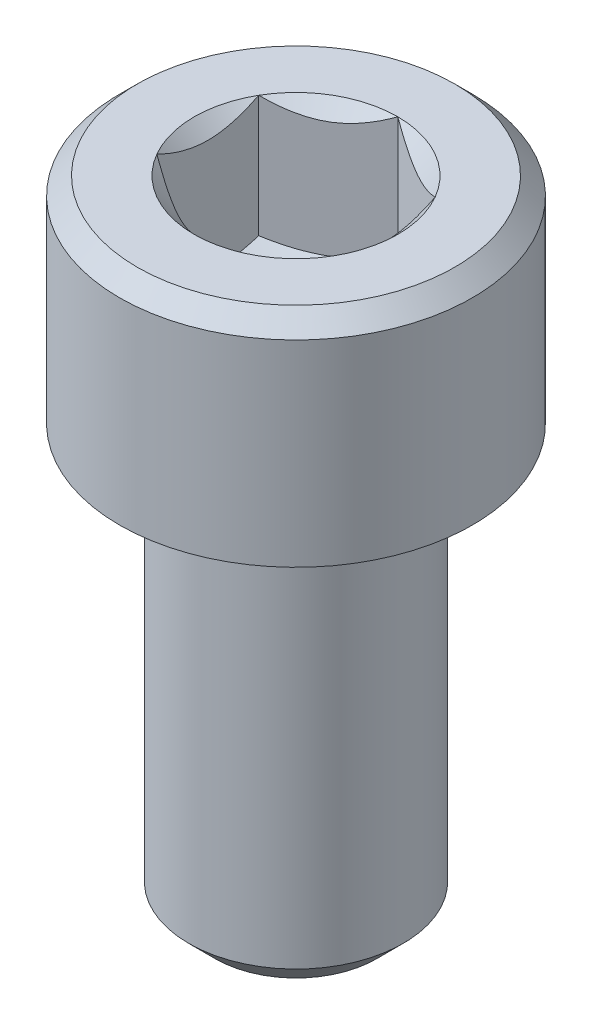
ISO-10303-21;
HEADER;
FILE_DESCRIPTION(('STEP AP214'),'2;1');
FILE_NAME('part.step','',(''),(''),'','','');
FILE_SCHEMA(('AUTOMOTIVE_DESIGN { 1 0 10303 214 1 1 1 1 }'));
ENDSEC;
DATA;
#1=APPLICATION_CONTEXT('core data for automotive mechanical design processes');
#2=APPLICATION_PROTOCOL_DEFINITION('international standard','automotive_design',2000,#1);
#3=PRODUCT_CONTEXT('',#1,'mechanical');
#4=PRODUCT('Part','Part','',(#3));
#5=PRODUCT_RELATED_PRODUCT_CATEGORY('part','',(#4));
#6=PRODUCT_DEFINITION_FORMATION('','',#4);
#7=PRODUCT_DEFINITION_CONTEXT('part definition',#1,'design');
#8=PRODUCT_DEFINITION('design','',#6,#7);
#9=PRODUCT_DEFINITION_SHAPE('','',#8);
#10=(LENGTH_UNIT() NAMED_UNIT(*) SI_UNIT(.MILLI.,.METRE.));
#11=(NAMED_UNIT(*) PLANE_ANGLE_UNIT() SI_UNIT($,.RADIAN.));
#12=(NAMED_UNIT(*) SI_UNIT($,.STERADIAN.) SOLID_ANGLE_UNIT());
#13=UNCERTAINTY_MEASURE_WITH_UNIT(LENGTH_MEASURE(1.E-05),#10,'distance_accuracy_value','');
#14=(GEOMETRIC_REPRESENTATION_CONTEXT(3) GLOBAL_UNCERTAINTY_ASSIGNED_CONTEXT((#13)) GLOBAL_UNIT_ASSIGNED_CONTEXT((#10,
#11,#12)) REPRESENTATION_CONTEXT('',''));
#15=CARTESIAN_POINT('',(0.,0.,0.));
#16=DIRECTION('',(0.,0.,1.));
#17=DIRECTION('',(1.,0.,0.));
#18=AXIS2_PLACEMENT_3D('',#15,#16,#17);
#19=CARTESIAN_POINT('',(0.,4.826,0.));
#20=DIRECTION('',(0.,1.,0.));
#21=DIRECTION('',(0.,0.,1.));
#22=AXIS2_PLACEMENT_3D('',#19,#20,#21);
#23=CONICAL_SURFACE('',#22,2.29135888084632,0.785398163397448);
#24=CARTESIAN_POINT('',(1.984575,4.82611547878185,1.14556397036933));
#25=CARTESIAN_POINT('',(1.9163590048332,4.78676285226392,1.18494849354192));
#26=CARTESIAN_POINT('',(1.84700231489304,4.74972131044619,1.22499159714897));
#27=CARTESIAN_POINT('',(1.70557619954781,4.68189885842333,1.30664400291398));
#28=CARTESIAN_POINT('',(1.63349332126322,4.65115568909176,1.34826107209555));
#29=CARTESIAN_POINT('',(1.488141602734,4.59849188881121,1.43217992591557));
#30=CARTESIAN_POINT('',(1.41490978751306,4.57643887587997,1.47446033414662));
#31=CARTESIAN_POINT('',(1.2668338174053,4.54246149294388,1.55995203534886));
#32=CARTESIAN_POINT('',(1.19199418724658,4.53051175609173,1.60316071596704));
#33=CARTESIAN_POINT('',(1.06301458545619,4.51973009908191,1.6776271237807));
#34=CARTESIAN_POINT('',(1.00904128422756,4.51813389905907,1.7087886237741));
#35=CARTESIAN_POINT('',(0.901182881480204,4.52082183886529,1.77106070163465));
#36=CARTESIAN_POINT('',(0.847297817514481,4.52510804034046,1.80217125782056));
#37=CARTESIAN_POINT('',(0.7400364617514,4.53931687301352,1.86409863044402));
#38=CARTESIAN_POINT('',(0.686660807239864,4.54924581045227,1.89491507894443));
#39=CARTESIAN_POINT('',(0.580832482591108,4.57419508427454,1.95601509066827));
#40=CARTESIAN_POINT('',(0.528379742028904,4.58921503038949,1.9862986945516));
#41=CARTESIAN_POINT('',(0.394017661036358,4.63380785163567,2.06387267818152));
#42=CARTESIAN_POINT('',(0.312941642841681,4.66674299593833,2.11068193911104));
#43=CARTESIAN_POINT('',(0.193726693270167,4.7223424412022,2.17951072233758));
#44=CARTESIAN_POINT('',(0.154440075614005,4.74187759205186,2.20219286161692));
#45=CARTESIAN_POINT('',(0.0765946381319541,4.7827287381194,2.24713694590236));
#46=CARTESIAN_POINT('',(0.0380353888983083,4.80404363956835,2.26939913882716));
#47=CARTESIAN_POINT('',(-0.000199999999994045,4.82611547878184,2.29147435090016));
#48=B_SPLINE_CURVE_WITH_KNOTS('',3,(#24,#25,#26,#27,#28,#29,#30,#31,#32,#33,#34,#35,#36,#37,#38,
#39,#40,#41,#42,#43,#44,#45,#46,#47),.UNSPECIFIED.,.F.,.F.,(4,2,2,2,2,2,2,2,2,2,2,4),(0.,
0.264339630306627,0.530219665093694,0.791876416371459,1.05287424418109,1.239639843932,
1.42647091743852,1.61351120244034,1.8005371524754,2.09764209964316,2.24579179873713,
2.39385111134156),.UNSPECIFIED.);
#49=CARTESIAN_POINT('',(1.984375,4.826,1.14567944042316));
#50=VERTEX_POINT('',#49);
#51=CARTESIAN_POINT('',(0.,4.826,2.29135888084632));
#52=VERTEX_POINT('',#51);
#53=EDGE_CURVE('E190',#50,#52,#48,.T.);
#54=ORIENTED_EDGE('',*,*,#53,.T.);
#55=CARTESIAN_POINT('',(0.,4.826,0.));
#56=DIRECTION('',(0.,1.,0.));
#57=DIRECTION('',(0.,0.,1.));
#58=AXIS2_PLACEMENT_3D('',#55,#56,#57);
#59=CIRCLE('',#58,2.29135888084632);
#60=EDGE_CURVE('E264',#52,#50,#59,.T.);
#61=ORIENTED_EDGE('',*,*,#60,.T.);
#62=EDGE_LOOP('',(#54,#61));
#63=FACE_BOUND('',#62,.T.);
#64=ADVANCED_FACE('F17',(#63),#23,.F.);
#65=CARTESIAN_POINT('',(-1.984375,4.826,1.14567944042317));
#66=VERTEX_POINT('',#65);
#67=EDGE_CURVE('E263',#66,#52,#59,.T.);
#68=ORIENTED_EDGE('',*,*,#67,.T.);
#69=CARTESIAN_POINT('',(0.000200000000005854,4.82611547878185,2.29147435090017));
#70=CARTESIAN_POINT('',(-0.0680159951667964,4.78676285226392,2.25208982772758));
#71=CARTESIAN_POINT('',(-0.13737268510696,4.74972131044619,2.21204672412052));
#72=CARTESIAN_POINT('',(-0.278798800452183,4.68189885842333,2.13039431835552));
#73=CARTESIAN_POINT('',(-0.350881678736778,4.65115568909176,2.08877724917394));
#74=CARTESIAN_POINT('',(-0.496233397266,4.59849188881122,2.00485839535392));
#75=CARTESIAN_POINT('',(-0.569465212486935,4.57643887587997,1.96257798712287));
#76=CARTESIAN_POINT('',(-0.717541182594703,4.54246149294388,1.87708628592063));
#77=CARTESIAN_POINT('',(-0.792380812753422,4.53051175609173,1.83387760530245));
#78=CARTESIAN_POINT('',(-0.921360414543812,4.51973009908191,1.75941119748879));
#79=CARTESIAN_POINT('',(-0.975333715772439,4.51813389905907,1.72824969749539));
#80=CARTESIAN_POINT('',(-1.0831921185198,4.52082183886529,1.66597761963484));
#81=CARTESIAN_POINT('',(-1.13707718248552,4.52510804034046,1.63486706344893));
#82=CARTESIAN_POINT('',(-1.2443385382486,4.53931687301352,1.57293969082547));
#83=CARTESIAN_POINT('',(-1.29771419276014,4.54924581045227,1.54212324232506));
#84=CARTESIAN_POINT('',(-1.40354251740889,4.57419508427454,1.48102323060122));
#85=CARTESIAN_POINT('',(-1.4559952579711,4.58921503038949,1.4507396267179));
#86=CARTESIAN_POINT('',(-1.59035733896364,4.63380785163567,1.37316564308797));
#87=CARTESIAN_POINT('',(-1.67143335715832,4.66674299593833,1.32635638215845));
#88=CARTESIAN_POINT('',(-1.79064830672984,4.7223424412022,1.25752759893191));
#89=CARTESIAN_POINT('',(-1.829934924386,4.74187759205186,1.23484545965257));
#90=CARTESIAN_POINT('',(-1.90778036186805,4.7827287381194,1.18990137536713));
#91=CARTESIAN_POINT('',(-1.9463396111017,4.80404363956835,1.16763918244233));
#92=CARTESIAN_POINT('',(-1.984575,4.82611547878184,1.14556397036933));
#93=B_SPLINE_CURVE_WITH_KNOTS('',3,(#69,#70,#71,#72,#73,#74,#75,#76,#77,#78,#79,#80,#81,#82,#83,
#84,#85,#86,#87,#88,#89,#90,#91,#92),.UNSPECIFIED.,.F.,.F.,(4,2,2,2,2,2,2,2,2,2,2,4),(0.,
0.264339630306629,0.530219665093698,0.791876416371465,1.0528742441811,1.23963984393201,
1.42647091743853,1.61351120244035,1.80053715247541,2.09764209964317,2.24579179873714,
2.39385111134158),.UNSPECIFIED.);
#94=EDGE_CURVE('E196',#52,#66,#93,.T.);
#95=ORIENTED_EDGE('',*,*,#94,.T.);
#96=EDGE_LOOP('',(#68,#95));
#97=FACE_BOUND('',#96,.T.);
#98=ADVANCED_FACE('F226',(#97),#23,.F.);
#99=CARTESIAN_POINT('',(1.984375,6.52130748324644,-3.45771088409132));
#100=CARTESIAN_POINT('',(1.984375,6.43262944586762,-3.35542683330867));
#101=CARTESIAN_POINT('',(1.984375,6.34446536162983,-3.25268780387356));
#102=CARTESIAN_POINT('',(1.984375,6.16953159373914,-3.04594702957405));
#103=CARTESIAN_POINT('',(1.984375,6.08276259352516,-2.94194470714935));
#104=CARTESIAN_POINT('',(1.984375,5.90909527980481,-2.73001070946145));
#105=CARTESIAN_POINT('',(1.984375,5.82223993416299,-2.62204368545491));
#106=CARTESIAN_POINT('',(1.984375,5.65116778000237,-2.40407276272223));
#107=CARTESIAN_POINT('',(1.984375,5.56695031553371,-2.29406938136794));
#108=CARTESIAN_POINT('',(1.984375,5.402042566665,-2.07120370981882));
#109=CARTESIAN_POINT('',(1.984375,5.32135716597924,-1.95833778205997));
#110=CARTESIAN_POINT('',(1.984375,5.16517668266955,-1.72888861173673));
#111=CARTESIAN_POINT('',(1.984375,5.08968585678648,-1.61230243243413));
#112=CARTESIAN_POINT('',(1.984375,4.947134431062,-1.37524803754826));
#113=CARTESIAN_POINT('',(1.984375,4.8800132606332,-1.25481673054247));
#114=CARTESIAN_POINT('',(1.984375,4.75778822517673,-1.00801151762188));
#115=CARTESIAN_POINT('',(1.984375,4.70266224970091,-0.881649076411231));
#116=CARTESIAN_POINT('',(1.984375,4.63323107564838,-0.685684715970747));
#117=CARTESIAN_POINT('',(1.984375,4.61213776738587,-0.61849922209624));
#118=CARTESIAN_POINT('',(1.984375,4.57579445135076,-0.482546235656733));
#119=CARTESIAN_POINT('',(1.984375,4.56054351090578,-0.413778997460118));
#120=CARTESIAN_POINT('',(1.984375,4.53689825717652,-0.275490831109883));
#121=CARTESIAN_POINT('',(1.984375,4.52846218390902,-0.205977179571446));
#122=CARTESIAN_POINT('',(1.984375,4.51890880020465,-0.0664443832858289));
#123=CARTESIAN_POINT('',(1.984375,4.51779072084056,0.00357470757907459));
#124=CARTESIAN_POINT('',(1.984375,4.52296292884912,0.143424006703545));
#125=CARTESIAN_POINT('',(1.984375,4.52926289019542,0.213253849018882));
#126=CARTESIAN_POINT('',(1.984375,4.54881043261024,0.351927006353266));
#127=CARTESIAN_POINT('',(1.984375,4.56205938187111,0.420770124352072));
#128=CARTESIAN_POINT('',(1.984375,4.59475382728509,0.557459490019311));
#129=CARTESIAN_POINT('',(1.984375,4.61424263881878,0.625295193543098));
#130=CARTESIAN_POINT('',(1.984375,4.6583635263663,0.759246417792875));
#131=CARTESIAN_POINT('',(1.984375,4.68299565938668,0.825361919443688));
#132=CARTESIAN_POINT('',(1.984375,4.74245510304685,0.970580741117794));
#133=CARTESIAN_POINT('',(1.984375,4.77832893658829,1.04925193970017));
#134=CARTESIAN_POINT('',(1.984375,4.85486121641692,1.20425175336704));
#135=CARTESIAN_POINT('',(1.984375,4.89552242697314,1.28057898264071));
#136=CARTESIAN_POINT('',(1.984375,4.98056622739607,1.43132281685668));
#137=CARTESIAN_POINT('',(1.984375,5.02495635189839,1.50573513623634));
#138=CARTESIAN_POINT('',(1.984375,5.1165292817791,1.65278836739454));
#139=CARTESIAN_POINT('',(1.984375,5.16371153170412,1.72542962746702));
#140=CARTESIAN_POINT('',(1.984375,5.26051114971045,1.86962401155094));
#141=CARTESIAN_POINT('',(1.984375,5.31014010813647,1.9411693187575));
#142=CARTESIAN_POINT('',(1.984375,5.41114100200018,2.08302186505396));
#143=CARTESIAN_POINT('',(1.984375,5.46251306880155,2.1533290102246));
#144=CARTESIAN_POINT('',(1.984375,5.61857454823435,2.36253483271691));
#145=CARTESIAN_POINT('',(1.984375,5.72532842618644,2.49989159715618));
#146=CARTESIAN_POINT('',(1.984375,5.94598591328433,2.77607806575545));
#147=CARTESIAN_POINT('',(1.984375,6.06000910834152,2.91481128320863));
#148=CARTESIAN_POINT('',(1.984375,6.23243856402619,3.12046871280676));
#149=CARTESIAN_POINT('',(1.984375,6.28982890842778,3.1882488408292));
#150=CARTESIAN_POINT('',(1.984375,6.40517040906204,3.32332427251419));
#151=CARTESIAN_POINT('',(1.984375,6.46312153554217,3.39061960157108));
#152=CARTESIAN_POINT('',(1.984375,6.52130748324643,3.45771088409131));
#153=B_SPLINE_CURVE_WITH_KNOTS('',3,(#99,#100,#101,#102,#103,#104,#105,#106,#107,#108,#109,#110,
#111,#112,#113,#114,#115,#116,#117,#118,#119,#120,#121,#122,#123,#124,#125,#126,#127,#128,#129,
#130,#131,#132,#133,#134,#135,#136,#137,#138,#139,#140,#141,#142,#143,#144,#145,#146,#147,#148,
#149,#150,#151,#152),.UNSPECIFIED.,.F.,.F.,(4,2,2,2,2,2,2,2,2,2,2,2,2,2,2,2,2,2,2,2,2,2,2,2,2,2,
4),(0.,0.406127590682088,0.812448423474265,1.2281189762356,1.64368533200276,2.05980921904513,
2.47627013871692,2.88951664651822,3.30199485039354,3.51304063418481,3.72405271268915,
3.93376173343452,4.14344871896586,4.35340946345541,4.5634115628274,4.77490424990243,
4.98639928120368,5.24557242311816,5.50489595439299,5.76475669481383,6.02456591232051,
6.28575340350717,6.54696062214587,7.06874360549046,7.6074336441421,7.87387094807471,
8.1402941927268),.UNSPECIFIED.);
#154=CARTESIAN_POINT('',(1.984375,4.826,-1.14567944042317));
#155=VERTEX_POINT('',#154);
#156=EDGE_CURVE('E125',#155,#50,#153,.T.);
#157=ORIENTED_EDGE('',*,*,#156,.T.);
#158=EDGE_CURVE('E261',#50,#155,#59,.T.);
#159=ORIENTED_EDGE('',*,*,#158,.T.);
#160=EDGE_LOOP('',(#157,#159));
#161=FACE_BOUND('',#160,.T.);
#162=ADVANCED_FACE('F231',(#161),#23,.F.);
#163=CARTESIAN_POINT('',(-1.984375,4.826,-1.14567944042317));
#164=VERTEX_POINT('',#163);
#165=EDGE_CURVE('E259',#164,#66,#59,.T.);
#166=ORIENTED_EDGE('',*,*,#165,.T.);
#167=CARTESIAN_POINT('',(-1.984375,6.52130748324645,3.45771088409133));
#168=CARTESIAN_POINT('',(-1.984375,6.43262944586763,3.35542683330868));
#169=CARTESIAN_POINT('',(-1.984375,6.34446536162984,3.25268780387358));
#170=CARTESIAN_POINT('',(-1.984375,6.16953159373915,3.04594702957407));
#171=CARTESIAN_POINT('',(-1.984375,6.08276259352517,2.94194470714937));
#172=CARTESIAN_POINT('',(-1.984375,5.90909527980482,2.73001070946146));
#173=CARTESIAN_POINT('',(-1.984375,5.822239934163,2.62204368545493));
#174=CARTESIAN_POINT('',(-1.984375,5.65116778000238,2.40407276272225));
#175=CARTESIAN_POINT('',(-1.984375,5.56695031553373,2.29406938136795));
#176=CARTESIAN_POINT('',(-1.984375,5.40204256666501,2.07120370981883));
#177=CARTESIAN_POINT('',(-1.984375,5.32135716597925,1.95833778205998));
#178=CARTESIAN_POINT('',(-1.984375,5.16517668266955,1.72888861173674));
#179=CARTESIAN_POINT('',(-1.984375,5.08968585678649,1.61230243243414));
#180=CARTESIAN_POINT('',(-1.984375,4.947134431062,1.37524803754827));
#181=CARTESIAN_POINT('',(-1.984375,4.88001326063321,1.25481673054247));
#182=CARTESIAN_POINT('',(-1.984375,4.75778822517673,1.00801151762189));
#183=CARTESIAN_POINT('',(-1.984375,4.70266224970091,0.881649076411242));
#184=CARTESIAN_POINT('',(-1.984375,4.63323107564838,0.685684715970757));
#185=CARTESIAN_POINT('',(-1.984375,4.61213776738587,0.618499222096249));
#186=CARTESIAN_POINT('',(-1.984375,4.57579445135076,0.482546235656741));
#187=CARTESIAN_POINT('',(-1.984375,4.56054351090578,0.413778997460127));
#188=CARTESIAN_POINT('',(-1.984375,4.53689825717652,0.275490831109891));
#189=CARTESIAN_POINT('',(-1.984375,4.52846218390903,0.205977179571455));
#190=CARTESIAN_POINT('',(-1.984375,4.51890880020465,0.0664443832858369));
#191=CARTESIAN_POINT('',(-1.984375,4.51779072084056,-0.00357470757906708));
#192=CARTESIAN_POINT('',(-1.984375,4.52296292884912,-0.143424006703538));
#193=CARTESIAN_POINT('',(-1.984375,4.52926289019542,-0.213253849018876));
#194=CARTESIAN_POINT('',(-1.984375,4.54881043261024,-0.351927006353261));
#195=CARTESIAN_POINT('',(-1.984375,4.56205938187111,-0.420770124352067));
#196=CARTESIAN_POINT('',(-1.984375,4.59475382728509,-0.557459490019306));
#197=CARTESIAN_POINT('',(-1.984375,4.61424263881878,-0.625295193543094));
#198=CARTESIAN_POINT('',(-1.984375,4.6583635263663,-0.759246417792871));
#199=CARTESIAN_POINT('',(-1.984375,4.68299565938668,-0.825361919443685));
#200=CARTESIAN_POINT('',(-1.984375,4.74245510304685,-0.970580741117791));
#201=CARTESIAN_POINT('',(-1.984375,4.77832893658829,-1.04925193970017));
#202=CARTESIAN_POINT('',(-1.984375,4.85486121641691,-1.20425175336703));
#203=CARTESIAN_POINT('',(-1.984375,4.89552242697314,-1.28057898264071));
#204=CARTESIAN_POINT('',(-1.984375,4.98056622739607,-1.43132281685667));
#205=CARTESIAN_POINT('',(-1.984375,5.02495635189838,-1.50573513623633));
#206=CARTESIAN_POINT('',(-1.984375,5.1165292817791,-1.65278836739453));
#207=CARTESIAN_POINT('',(-1.984375,5.16371153170412,-1.72542962746701));
#208=CARTESIAN_POINT('',(-1.984375,5.26051114971045,-1.86962401155093));
#209=CARTESIAN_POINT('',(-1.984375,5.31014010813646,-1.9411693187575));
#210=CARTESIAN_POINT('',(-1.984375,5.41114100200017,-2.08302186505395));
#211=CARTESIAN_POINT('',(-1.984375,5.46251306880154,-2.15332901022459));
#212=CARTESIAN_POINT('',(-1.984375,5.61857454823435,-2.3625348327169));
#213=CARTESIAN_POINT('',(-1.984375,5.72532842618643,-2.49989159715617));
#214=CARTESIAN_POINT('',(-1.984375,5.94598591328432,-2.77607806575545));
#215=CARTESIAN_POINT('',(-1.984375,6.06000910834152,-2.91481128320863));
#216=CARTESIAN_POINT('',(-1.984375,6.2324385640262,-3.12046871280677));
#217=CARTESIAN_POINT('',(-1.984375,6.2898289084278,-3.18824884082921));
#218=CARTESIAN_POINT('',(-1.984375,6.40517040906206,-3.32332427251421));
#219=CARTESIAN_POINT('',(-1.984375,6.46312153554218,-3.3906196015711));
#220=CARTESIAN_POINT('',(-1.984375,6.52130748324645,-3.45771088409133));
#221=B_SPLINE_CURVE_WITH_KNOTS('',3,(#167,#168,#169,#170,#171,#172,#173,#174,#175,#176,#177,
#178,#179,#180,#181,#182,#183,#184,#185,#186,#187,#188,#189,#190,#191,#192,#193,#194,#195,#196,
#197,#198,#199,#200,#201,#202,#203,#204,#205,#206,#207,#208,#209,#210,#211,#212,#213,#214,#215,
#216,#217,#218,#219,#220),.UNSPECIFIED.,.F.,.F.,(4,2,2,2,2,2,2,2,2,2,2,2,2,2,2,2,2,2,2,2,2,2,2,
2,2,2,4),(0.,0.406127590682087,0.812448423474264,1.2281189762356,1.64368533200276,
2.05980921904514,2.47627013871693,2.88951664651823,3.30199485039355,3.51304063418482,
3.72405271268916,3.93376173343454,4.14344871896587,4.35340946345543,4.56341156282742,
4.77490424990244,4.9863992812037,5.24557242311818,5.504895954393,5.76475669481384,
6.02456591232052,6.28575340350718,6.54696062214588,7.06874360549046,7.60743364414213,
7.87387094807475,8.14029419272685),.UNSPECIFIED.);
#222=EDGE_CURVE('E206',#66,#164,#221,.T.);
#223=ORIENTED_EDGE('',*,*,#222,.T.);
#224=EDGE_LOOP('',(#166,#223));
#225=FACE_BOUND('',#224,.T.);
#226=ADVANCED_FACE('F244',(#225),#23,.F.);
#227=CARTESIAN_POINT('',(0.,4.826,-2.29135888084632));
#228=VERTEX_POINT('',#227);
#229=EDGE_CURVE('E255',#228,#164,#59,.T.);
#230=ORIENTED_EDGE('',*,*,#229,.T.);
#231=CARTESIAN_POINT('',(-1.984575,4.82611547878184,-1.14556397036933));
#232=CARTESIAN_POINT('',(-1.9163590048332,4.78676285226391,-1.18494849354192));
#233=CARTESIAN_POINT('',(-1.84700231489303,4.74972131044619,-1.22499159714897));
#234=CARTESIAN_POINT('',(-1.70557619954781,4.68189885842332,-1.30664400291398));
#235=CARTESIAN_POINT('',(-1.63349332126322,4.65115568909175,-1.34826107209555));
#236=CARTESIAN_POINT('',(-1.488141602734,4.59849188881121,-1.43217992591557));
#237=CARTESIAN_POINT('',(-1.41490978751306,4.57643887587997,-1.47446033414662));
#238=CARTESIAN_POINT('',(-1.2668338174053,4.54246149294388,-1.55995203534886));
#239=CARTESIAN_POINT('',(-1.19199418724658,4.53051175609173,-1.60316071596704));
#240=CARTESIAN_POINT('',(-1.06301458545619,4.51973009908191,-1.6776271237807));
#241=CARTESIAN_POINT('',(-1.00904128422756,4.51813389905907,-1.7087886237741));
#242=CARTESIAN_POINT('',(-0.901182881480203,4.52082183886529,-1.77106070163465));
#243=CARTESIAN_POINT('',(-0.84729781751448,4.52510804034046,-1.80217125782056));
#244=CARTESIAN_POINT('',(-0.740036461751399,4.53931687301352,-1.86409863044402));
#245=CARTESIAN_POINT('',(-0.686660807239862,4.54924581045227,-1.89491507894443));
#246=CARTESIAN_POINT('',(-0.580832482591107,4.57419508427454,-1.95601509066827));
#247=CARTESIAN_POINT('',(-0.528379742028903,4.58921503038949,-1.9862986945516));
#248=CARTESIAN_POINT('',(-0.394017661036357,4.63380785163567,-2.06387267818152));
#249=CARTESIAN_POINT('',(-0.31294164284168,4.66674299593833,-2.11068193911104));
#250=CARTESIAN_POINT('',(-0.193726693270166,4.7223424412022,-2.17951072233758));
#251=CARTESIAN_POINT('',(-0.154440075614005,4.74187759205186,-2.20219286161691));
#252=CARTESIAN_POINT('',(-0.0765946381319542,4.7827287381194,-2.24713694590236));
#253=CARTESIAN_POINT('',(-0.038035388898309,4.80404363956835,-2.26939913882716));
#254=CARTESIAN_POINT('',(0.000199999999992446,4.82611547878184,-2.29147435090016));
#255=B_SPLINE_CURVE_WITH_KNOTS('',3,(#231,#232,#233,#234,#235,#236,#237,#238,#239,#240,#241,
#242,#243,#244,#245,#246,#247,#248,#249,#250,#251,#252,#253,#254),.UNSPECIFIED.,.F.,.F.,(4,2,2,
2,2,2,2,2,2,2,2,4),(0.,0.264339630306625,0.530219665093691,0.791876416371454,1.05287424418108,
1.23963984393199,1.42647091743851,1.61351120244034,1.80053715247539,2.09764209964315,
2.24579179873712,2.39385111134156),.UNSPECIFIED.);
#256=EDGE_CURVE('E96',#164,#228,#255,.T.);
#257=ORIENTED_EDGE('',*,*,#256,.T.);
#258=EDGE_LOOP('',(#230,#257));
#259=FACE_BOUND('',#258,.T.);
#260=ADVANCED_FACE('F235',(#259),#23,.F.);
#261=CARTESIAN_POINT('',(0.,-4.4061663954414,0.));
#262=DIRECTION('',(0.,1.,0.));
#263=DIRECTION('',(0.,0.,1.));
#264=AXIS2_PLACEMENT_3D('',#261,#262,#263);
#265=CYLINDRICAL_SURFACE('',#264,3.96875);
#266=CARTESIAN_POINT('',(0.,4.429125,0.));
#267=DIRECTION('',(0.,1.,0.));
#268=DIRECTION('',(0.,0.,1.));
#269=AXIS2_PLACEMENT_3D('',#266,#267,#268);
#270=CIRCLE('',#269,3.96875);
#271=CARTESIAN_POINT('',(0.,4.429125,3.96875));
#272=VERTEX_POINT('',#271);
#273=EDGE_CURVE('E212',#272,#272,#270,.T.);
#274=ORIENTED_EDGE('',*,*,#273,.F.);
#275=EDGE_LOOP('',(#274));
#276=FACE_BOUND('',#275,.T.);
#277=CARTESIAN_POINT('',(0.,0.,0.));
#278=DIRECTION('',(0.,1.,0.));
#279=DIRECTION('',(0.,0.,1.));
#280=AXIS2_PLACEMENT_3D('',#277,#278,#279);
#281=CIRCLE('',#280,3.96875);
#282=CARTESIAN_POINT('',(0.,0.,3.96875));
#283=VERTEX_POINT('',#282);
#284=EDGE_CURVE('E11',#283,#283,#281,.T.);
#285=ORIENTED_EDGE('',*,*,#284,.T.);
#286=EDGE_LOOP('',(#285));
#287=FACE_BOUND('',#286,.T.);
#288=ADVANCED_FACE('F19',(#276,#287),#265,.T.);
#289=CARTESIAN_POINT('',(0.,0.,3.254375));
#290=DIRECTION('',(0.,1.,0.));
#291=DIRECTION('',(0.,0.,1.));
#292=AXIS2_PLACEMENT_3D('',#289,#290,#291);
#293=PLANE('',#292);
#294=ORIENTED_EDGE('',*,*,#284,.F.);
#295=EDGE_LOOP('',(#294));
#296=FACE_BOUND('',#295,.T.);
#297=CARTESIAN_POINT('',(0.,0.,0.));
#298=DIRECTION('',(0.,1.,0.));
#299=DIRECTION('',(0.,0.,1.));
#300=AXIS2_PLACEMENT_3D('',#297,#298,#299);
#301=CIRCLE('',#300,2.54);
#302=CARTESIAN_POINT('',(0.,0.,2.54));
#303=VERTEX_POINT('',#302);
#304=EDGE_CURVE('E25',#303,#303,#301,.T.);
#305=ORIENTED_EDGE('',*,*,#304,.T.);
#306=EDGE_LOOP('',(#305));
#307=FACE_BOUND('',#306,.T.);
#308=ADVANCED_FACE('F250',(#296,#307),#293,.F.);
#309=CARTESIAN_POINT('',(0.,-0.127,0.));
#310=DIRECTION('',(0.,1.,0.));
#311=DIRECTION('',(0.,0.,1.));
#312=AXIS2_PLACEMENT_3D('',#309,#310,#311);
#313=TOROIDAL_SURFACE('',#312,2.54,0.127);
#314=ORIENTED_EDGE('',*,*,#304,.F.);
#315=EDGE_LOOP('',(#314));
#316=FACE_BOUND('',#315,.T.);
#317=CARTESIAN_POINT('',(0.,-0.127,0.));
#318=DIRECTION('',(0.,1.,0.));
#319=DIRECTION('',(0.,0.,1.));
#320=AXIS2_PLACEMENT_3D('',#317,#318,#319);
#321=CIRCLE('',#320,2.413);
#322=CARTESIAN_POINT('',(0.,-0.127,2.413));
#323=VERTEX_POINT('',#322);
#324=EDGE_CURVE('E274',#323,#323,#321,.T.);
#325=ORIENTED_EDGE('',*,*,#324,.T.);
#326=EDGE_LOOP('',(#325));
#327=FACE_BOUND('',#326,.T.);
#328=ADVANCED_FACE('F280',(#316,#327),#313,.F.);
#329=CARTESIAN_POINT('',(0.,-4.4061663954414,0.));
#330=DIRECTION('',(0.,1.,0.));
#331=DIRECTION('',(0.,0.,1.));
#332=AXIS2_PLACEMENT_3D('',#329,#330,#331);
#333=CYLINDRICAL_SURFACE('',#332,2.413);
#334=ORIENTED_EDGE('',*,*,#324,.F.);
#335=EDGE_LOOP('',(#334));
#336=FACE_BOUND('',#335,.T.);
#337=CARTESIAN_POINT('',(0.,-8.9281,0.));
#338=DIRECTION('',(0.,1.,0.));
#339=DIRECTION('',(0.,0.,1.));
#340=AXIS2_PLACEMENT_3D('',#337,#338,#339);
#341=CIRCLE('',#340,2.413);
#342=CARTESIAN_POINT('',(0.,-8.9281,2.413));
#343=VERTEX_POINT('',#342);
#344=EDGE_CURVE('E271',#343,#343,#341,.T.);
#345=ORIENTED_EDGE('',*,*,#344,.T.);
#346=EDGE_LOOP('',(#345));
#347=FACE_BOUND('',#346,.T.);
#348=ADVANCED_FACE('F283',(#336,#347),#333,.T.);
#349=CARTESIAN_POINT('',(0.,-9.525,0.));
#350=DIRECTION('',(0.,1.,0.));
#351=DIRECTION('',(0.,0.,1.));
#352=AXIS2_PLACEMENT_3D('',#349,#350,#351);
#353=CONICAL_SURFACE('',#352,1.8161,0.785398163397448);
#354=ORIENTED_EDGE('',*,*,#344,.F.);
#355=EDGE_LOOP('',(#354));
#356=FACE_BOUND('',#355,.T.);
#357=CARTESIAN_POINT('',(0.,-9.525,0.));
#358=DIRECTION('',(0.,1.,0.));
#359=DIRECTION('',(0.,0.,1.));
#360=AXIS2_PLACEMENT_3D('',#357,#358,#359);
#361=CIRCLE('',#360,1.8161);
#362=CARTESIAN_POINT('',(0.,-9.525,1.8161));
#363=VERTEX_POINT('',#362);
#364=EDGE_CURVE('E267',#363,#363,#361,.T.);
#365=ORIENTED_EDGE('',*,*,#364,.T.);
#366=EDGE_LOOP('',(#365));
#367=FACE_BOUND('',#366,.T.);
#368=ADVANCED_FACE('F241',(#356,#367),#353,.T.);
#369=CARTESIAN_POINT('',(0.,-9.525,0.90805));
#370=DIRECTION('',(0.,1.,0.));
#371=DIRECTION('',(0.,0.,1.));
#372=AXIS2_PLACEMENT_3D('',#369,#370,#371);
#373=PLANE('',#372);
#374=ORIENTED_EDGE('',*,*,#364,.F.);
#375=EDGE_LOOP('',(#374));
#376=FACE_BOUND('',#375,.T.);
#377=ADVANCED_FACE('F158',(#376),#373,.F.);
#378=EDGE_CURVE('E258',#155,#228,#59,.T.);
#379=ORIENTED_EDGE('',*,*,#378,.T.);
#380=CARTESIAN_POINT('',(-0.000200000000007589,4.82611547878185,-2.29147435090017));
#381=CARTESIAN_POINT('',(0.0680159951667949,4.78676285226392,-2.25208982772758));
#382=CARTESIAN_POINT('',(0.137372685106959,4.74972131044619,-2.21204672412052));
#383=CARTESIAN_POINT('',(0.278798800452181,4.68189885842333,-2.13039431835551));
#384=CARTESIAN_POINT('',(0.350881678736777,4.65115568909176,-2.08877724917394));
#385=CARTESIAN_POINT('',(0.496233397265999,4.59849188881122,-2.00485839535392));
#386=CARTESIAN_POINT('',(0.569465212486934,4.57643887587997,-1.96257798712287));
#387=CARTESIAN_POINT('',(0.717541182594702,4.54246149294388,-1.87708628592063));
#388=CARTESIAN_POINT('',(0.792380812753422,4.53051175609173,-1.83387760530245));
#389=CARTESIAN_POINT('',(0.921360414543813,4.51973009908191,-1.75941119748879));
#390=CARTESIAN_POINT('',(0.975333715772439,4.51813389905907,-1.72824969749539));
#391=CARTESIAN_POINT('',(1.0831921185198,4.52082183886529,-1.66597761963484));
#392=CARTESIAN_POINT('',(1.13707718248552,4.52510804034046,-1.63486706344893));
#393=CARTESIAN_POINT('',(1.2443385382486,4.53931687301352,-1.57293969082547));
#394=CARTESIAN_POINT('',(1.29771419276014,4.54924581045227,-1.54212324232506));
#395=CARTESIAN_POINT('',(1.40354251740889,4.57419508427454,-1.48102323060122));
#396=CARTESIAN_POINT('',(1.4559952579711,4.58921503038949,-1.45073962671789));
#397=CARTESIAN_POINT('',(1.59035733896364,4.63380785163567,-1.37316564308797));
#398=CARTESIAN_POINT('',(1.67143335715832,4.66674299593833,-1.32635638215845));
#399=CARTESIAN_POINT('',(1.79064830672984,4.7223424412022,-1.25752759893191));
#400=CARTESIAN_POINT('',(1.829934924386,4.74187759205186,-1.23484545965257));
#401=CARTESIAN_POINT('',(1.90778036186805,4.7827287381194,-1.18990137536713));
#402=CARTESIAN_POINT('',(1.9463396111017,4.80404363956835,-1.16763918244233));
#403=CARTESIAN_POINT('',(1.984575,4.82611547878184,-1.14556397036933));
#404=B_SPLINE_CURVE_WITH_KNOTS('',3,(#380,#381,#382,#383,#384,#385,#386,#387,#388,#389,#390,
#391,#392,#393,#394,#395,#396,#397,#398,#399,#400,#401,#402,#403),.UNSPECIFIED.,.F.,.F.,(4,2,2,
2,2,2,2,2,2,2,2,4),(0.,0.264339630306629,0.530219665093699,0.791876416371466,1.0528742441811,
1.23963984393201,1.42647091743853,1.61351120244035,1.80053715247541,2.09764209964317,
2.24579179873714,2.39385111134158),.UNSPECIFIED.);
#405=EDGE_CURVE('E31',#228,#155,#404,.T.);
#406=ORIENTED_EDGE('',*,*,#405,.T.);
#407=EDGE_LOOP('',(#379,#406));
#408=FACE_BOUND('',#407,.T.);
#409=ADVANCED_FACE('F132',(#408),#23,.F.);
#410=CARTESIAN_POINT('',(0.,4.826,2.93161694042316));
#411=DIRECTION('',(0.,1.,0.));
#412=DIRECTION('',(0.,0.,1.));
#413=AXIS2_PLACEMENT_3D('',#410,#411,#412);
#414=PLANE('',#413);
#415=CARTESIAN_POINT('',(0.,4.826,0.));
#416=DIRECTION('',(0.,1.,0.));
#417=DIRECTION('',(0.,0.,1.));
#418=AXIS2_PLACEMENT_3D('',#415,#416,#417);
#419=CIRCLE('',#418,3.571875);
#420=CARTESIAN_POINT('',(0.,4.826,3.571875));
#421=VERTEX_POINT('',#420);
#422=EDGE_CURVE('E268',#421,#421,#419,.T.);
#423=ORIENTED_EDGE('',*,*,#422,.T.);
#424=EDGE_LOOP('',(#423));
#425=FACE_BOUND('',#424,.T.);
#426=ORIENTED_EDGE('',*,*,#60,.F.);
#427=ORIENTED_EDGE('',*,*,#67,.F.);
#428=ORIENTED_EDGE('',*,*,#165,.F.);
#429=ORIENTED_EDGE('',*,*,#229,.F.);
#430=ORIENTED_EDGE('',*,*,#378,.F.);
#431=ORIENTED_EDGE('',*,*,#158,.F.);
#432=EDGE_LOOP('',(#426,#427,#428,#429,#430,#431));
#433=FACE_BOUND('',#432,.T.);
#434=ADVANCED_FACE('F234',(#425,#433),#414,.T.);
#435=CARTESIAN_POINT('',(0.,4.429125,0.));
#436=DIRECTION('',(0.,-1.,0.));
#437=DIRECTION('',(0.,0.,-1.));
#438=AXIS2_PLACEMENT_3D('',#435,#436,#437);
#439=CONICAL_SURFACE('',#438,3.96875,0.785398163397446);
#440=ORIENTED_EDGE('',*,*,#422,.F.);
#441=EDGE_LOOP('',(#440));
#442=FACE_BOUND('',#441,.T.);
#443=ORIENTED_EDGE('',*,*,#273,.T.);
#444=EDGE_LOOP('',(#443));
#445=FACE_BOUND('',#444,.T.);
#446=ADVANCED_FACE('F143',(#442,#445),#439,.T.);
#447=CARTESIAN_POINT('',(-1.984375,-1.11065121348229,0.));
#448=DIRECTION('',(-1.,0.,0.));
#449=DIRECTION('',(0.,0.,1.));
#450=AXIS2_PLACEMENT_3D('',#447,#448,#449);
#451=PLANE('',#450);
#452=ORIENTED_EDGE('',*,*,#222,.F.);
#453=DIRECTION('',(0.,1.,0.));
#454=VECTOR('',#453,1.);
#455=CARTESIAN_POINT('',(-1.984375,-1.11065121348229,1.14567944042317));
#456=LINE('',#455,#454);
#457=CARTESIAN_POINT('',(-1.984375,2.08945452467681,1.14567944042317));
#458=VERTEX_POINT('',#457);
#459=EDGE_CURVE('E80',#458,#66,#456,.T.);
#460=ORIENTED_EDGE('',*,*,#459,.F.);
#461=CARTESIAN_POINT('',(-1.984375,4.42690590287542,-5.85436456510872));
#462=CARTESIAN_POINT('',(-1.984375,4.35588977333528,-5.72956329140089));
#463=CARTESIAN_POINT('',(-1.984375,4.28504525904714,-5.6046641146275));
#464=CARTESIAN_POINT('',(-1.984375,4.14378184169921,-5.35462320385654));
#465=CARTESIAN_POINT('',(-1.984375,4.07336294423938,-5.22948146669601));
#466=CARTESIAN_POINT('',(-1.984375,3.86279955126344,-4.85349954828694));
#467=CARTESIAN_POINT('',(-1.984375,3.72342088659338,-4.60222973342793));
#468=CARTESIAN_POINT('',(-1.984375,3.44532150214495,-4.09354827294376));
#469=CARTESIAN_POINT('',(-1.984375,3.30665564054007,-3.83610641521804));
#470=CARTESIAN_POINT('',(-1.984375,3.1026760457673,-3.4478641870196));
#471=CARTESIAN_POINT('',(-1.984375,3.03535982886417,-3.31811778611126));
#472=CARTESIAN_POINT('',(-1.984375,2.90252103290932,-3.05771181575713));
#473=CARTESIAN_POINT('',(-1.984375,2.83699840326312,-2.92705227220056));
#474=CARTESIAN_POINT('',(-1.984375,2.70251106828089,-2.65258581347795));
#475=CARTESIAN_POINT('',(-1.984375,2.63377654243134,-2.50866550174564));
#476=CARTESIAN_POINT('',(-1.984375,2.50041004150475,-2.21887100441734));
#477=CARTESIAN_POINT('',(-1.984375,2.43577916207758,-2.07299630949728));
#478=CARTESIAN_POINT('',(-1.984375,2.31278760505755,-1.77909828864268));
#479=CARTESIAN_POINT('',(-1.984375,2.25440918103385,-1.63108247464689));
#480=CARTESIAN_POINT('',(-1.984375,2.14680535241344,-1.33172418244179));
#481=CARTESIAN_POINT('',(-1.984375,2.09757584845007,-1.18038322828851));
#482=CARTESIAN_POINT('',(-1.984375,2.02659350968816,-0.923330403581481));
#483=CARTESIAN_POINT('',(-1.984375,2.00110150498184,-0.818666325060482));
#484=CARTESIAN_POINT('',(-1.984375,1.95822925638616,-0.607678025855771));
#485=CARTESIAN_POINT('',(-1.984375,1.94084644098805,-0.501354342518222));
#486=CARTESIAN_POINT('',(-1.984375,1.91589057691193,-0.2882388302413));
#487=CARTESIAN_POINT('',(-1.984375,1.90825325724032,-0.181454778048269));
#488=CARTESIAN_POINT('',(-1.984375,1.90342915050395,0.0323480596777593));
#489=CARTESIAN_POINT('',(-1.984375,1.9062418379514,0.13936683313713));
#490=CARTESIAN_POINT('',(-1.984375,1.92376727381035,0.376366051555178));
#491=CARTESIAN_POINT('',(-1.984375,1.94098769581022,0.506159325108051));
#492=CARTESIAN_POINT('',(-1.984375,1.98805756970463,0.763434105332207));
#493=CARTESIAN_POINT('',(-1.984375,2.01791766687064,0.890913568689601));
#494=CARTESIAN_POINT('',(-1.984375,2.08778292156683,1.14586487289779));
#495=CARTESIAN_POINT('',(-1.984375,2.12798732256046,1.27328071713379));
#496=CARTESIAN_POINT('',(-1.984375,2.19352840838852,1.46252740118767));
#497=CARTESIAN_POINT('',(-1.984375,2.2162461419508,1.52529261118088));
#498=CARTESIAN_POINT('',(-1.984375,2.26316080249081,1.65026823952602));
#499=CARTESIAN_POINT('',(-1.984375,2.28735770562138,1.71247866680365));
#500=CARTESIAN_POINT('',(-1.984375,2.3494998494132,1.86763713423447));
#501=CARTESIAN_POINT('',(-1.984375,2.38822677604846,1.96027125624634));
#502=CARTESIAN_POINT('',(-1.984375,2.46785672721174,2.14460225768427));
#503=CARTESIAN_POINT('',(-1.984375,2.50875993722951,2.23629905642346));
#504=CARTESIAN_POINT('',(-1.984375,2.63402283493444,2.51028267483398));
#505=CARTESIAN_POINT('',(-1.984375,2.7209139442596,2.69140985357736));
#506=CARTESIAN_POINT('',(-1.984375,2.89906871634569,3.05178783835767));
#507=CARTESIAN_POINT('',(-1.984375,2.99033832092699,3.23103566791593));
#508=CARTESIAN_POINT('',(-1.984375,3.17574141958964,3.58805097493485));
#509=CARTESIAN_POINT('',(-1.984375,3.26987505156938,3.7658183805889));
#510=CARTESIAN_POINT('',(-1.984375,3.45131637099216,4.10386455026829));
#511=CARTESIAN_POINT('',(-1.984375,3.538448575724,4.26423787944478));
#512=CARTESIAN_POINT('',(-1.984375,3.71393414109542,4.58432496888202));
#513=CARTESIAN_POINT('',(-1.984375,3.80228756396531,4.74403869498838));
#514=CARTESIAN_POINT('',(-1.984375,3.97961913446741,5.06242098987328));
#515=CARTESIAN_POINT('',(-1.984375,4.06859421819799,5.22109126791615));
#516=CARTESIAN_POINT('',(-1.984375,4.24725992927077,5.53801313064387));
#517=CARTESIAN_POINT('',(-1.984375,4.33695050303506,5.69626474551931));
#518=CARTESIAN_POINT('',(-1.984375,4.42690590287542,5.85436456510873));
#519=B_SPLINE_CURVE_WITH_KNOTS('',3,(#461,#462,#463,#464,#465,#466,#467,#468,#469,#470,#471,
#472,#473,#474,#475,#476,#477,#478,#479,#480,#481,#482,#483,#484,#485,#486,#487,#488,#489,#490,
#491,#492,#493,#494,#495,#496,#497,#498,#499,#500,#501,#502,#503,#504,#505,#506,#507,#508,#509,
#510,#511,#512,#513,#514,#515,#516,#517,#518),.UNSPECIFIED.,.F.,.F.,(4,2,2,2,2,2,2,2,2,2,2,2,2,
2,2,2,2,2,2,2,2,2,2,2,2,2,2,2,4),(0.,0.43077598014733,0.861557615856061,1.7235598234942,
2.60074943761127,3.03924870835694,3.47773559690274,3.95616691296619,4.43472543488823,
4.91188749900691,5.38883524237575,5.71175873233176,6.03457975014529,6.35526058812353,
6.67592530060241,7.06791248496861,7.460230464114,7.86075912977083,8.06099644755657,
8.26123053796691,8.56240284285516,8.86360085861743,9.46616836322798,10.0695780837202,
10.6730169035567,11.2205550033425,11.7681211079588,12.3138620910024,12.8595625840278),.UNSPECIFIED.);
#520=CARTESIAN_POINT('',(-1.984375,2.08945452467681,-1.14567944042317));
#521=VERTEX_POINT('',#520);
#522=EDGE_CURVE('E72',#521,#458,#519,.T.);
#523=ORIENTED_EDGE('',*,*,#522,.F.);
#524=DIRECTION('',(0.,1.,0.));
#525=VECTOR('',#524,1.);
#526=CARTESIAN_POINT('',(-1.984375,-1.11065121348229,-1.14567944042317));
#527=LINE('',#526,#525);
#528=EDGE_CURVE('E77',#521,#164,#527,.T.);
#529=ORIENTED_EDGE('',*,*,#528,.T.);
#530=EDGE_LOOP('',(#452,#460,#523,#529));
#531=FACE_BOUND('',#530,.T.);
#532=ADVANCED_FACE('F75',(#531),#451,.F.);
#533=CARTESIAN_POINT('',(-0.9921875,-1.11065121348229,1.71851916063474));
#534=DIRECTION('',(-0.5,0.,0.866025403784439));
#535=DIRECTION('',(0.866025403784439,0.,0.5));
#536=AXIS2_PLACEMENT_3D('',#533,#534,#535);
#537=PLANE('',#536);
#538=ORIENTED_EDGE('',*,*,#94,.F.);
#539=DIRECTION('',(0.,1.,0.));
#540=VECTOR('',#539,1.);
#541=CARTESIAN_POINT('',(0.,-1.11065121348229,2.29135888084632));
#542=LINE('',#541,#540);
#543=CARTESIAN_POINT('',(0.,2.08945452467681,2.29135888084632));
#544=VERTEX_POINT('',#543);
#545=EDGE_CURVE('E98',#544,#52,#542,.T.);
#546=ORIENTED_EDGE('',*,*,#545,.F.);
#547=CARTESIAN_POINT('',(-1.984575,2.08952391132915,1.14556397036933));
#548=CARTESIAN_POINT('',(-1.89705460835446,2.05914988425222,1.19609389204546));
#549=CARTESIAN_POINT('',(-1.80871593451387,2.03151291970104,1.24709624916718));
#550=CARTESIAN_POINT('',(-1.63037606865432,1.98328530268078,1.35006081872843));
#551=CARTESIAN_POINT('',(-1.54037109014686,1.9627135240882,1.40202521729812));
#552=CARTESIAN_POINT('',(-1.36157025703134,1.9308008905659,1.5052559264287));
#553=CARTESIAN_POINT('',(-1.27280675615278,1.91922716833824,1.55650355755515));
#554=CARTESIAN_POINT('',(-1.09483713007289,1.90555342459226,1.65925436907995));
#555=CARTESIAN_POINT('',(-1.00563177151199,1.90344053342442,1.71075710685824));
#556=CARTESIAN_POINT('',(-0.839733404475869,1.90849444412372,1.80653857372466));
#557=CARTESIAN_POINT('',(-0.763009503767488,1.91442305566002,1.85083513845193));
#558=CARTESIAN_POINT('',(-0.610105360744215,1.93299548491518,1.93911438658662));
#559=CARTESIAN_POINT('',(-0.533925746040508,1.9456460813446,1.98309670764257));
#560=CARTESIAN_POINT('',(-0.380689466082018,1.97718918590136,2.07156771512622));
#561=CARTESIAN_POINT('',(-0.303655281302754,1.99622350145743,2.11604342244533));
#562=CARTESIAN_POINT('',(-0.150821953691098,2.03934788758007,2.20428178528307));
#563=CARTESIAN_POINT('',(-0.0750205197574403,2.06342704656957,2.24804576356962));
#564=CARTESIAN_POINT('',(0.000200000000005614,2.08952391132916,2.29147435090017));
#565=B_SPLINE_CURVE_WITH_KNOTS('',3,(#547,#548,#549,#550,#551,#552,#553,#554,#555,#556,#557,
#558,#559,#560,#561,#562,#563,#564),.UNSPECIFIED.,.F.,.F.,(4,2,2,2,2,2,2,2,4),(0.,
0.316717009096853,0.634273629527879,0.943309807734604,1.2519254734173,1.51802915880327,
1.78440170418935,2.05713355507813,2.3292814894869),.UNSPECIFIED.);
#566=EDGE_CURVE('E83',#458,#544,#565,.T.);
#567=ORIENTED_EDGE('',*,*,#566,.F.);
#568=ORIENTED_EDGE('',*,*,#459,.T.);
#569=EDGE_LOOP('',(#538,#546,#567,#568));
#570=FACE_BOUND('',#569,.T.);
#571=ADVANCED_FACE('F185',(#570),#537,.F.);
#572=CARTESIAN_POINT('',(0.9921875,-1.11065121348229,1.71851916063474));
#573=DIRECTION('',(0.5,0.,0.866025403784439));
#574=DIRECTION('',(0.866025403784439,0.,-0.5));
#575=AXIS2_PLACEMENT_3D('',#572,#573,#574);
#576=PLANE('',#575);
#577=ORIENTED_EDGE('',*,*,#53,.F.);
#578=DIRECTION('',(0.,1.,0.));
#579=VECTOR('',#578,1.);
#580=CARTESIAN_POINT('',(1.984375,-1.11065121348229,1.14567944042315));
#581=LINE('',#580,#579);
#582=CARTESIAN_POINT('',(1.984375,2.08945452467681,1.14567944042316));
#583=VERTEX_POINT('',#582);
#584=EDGE_CURVE('E111',#583,#50,#581,.T.);
#585=ORIENTED_EDGE('',*,*,#584,.F.);
#586=CARTESIAN_POINT('',(-0.000199999999994145,2.08952391132915,2.29147435090016));
#587=CARTESIAN_POINT('',(0.0873203916455412,2.05914988425222,2.24094442922403));
#588=CARTESIAN_POINT('',(0.175659065486135,2.03151291970104,2.18994207210231));
#589=CARTESIAN_POINT('',(0.353998931345687,1.98328530268078,2.08697750254106));
#590=CARTESIAN_POINT('',(0.444003909853141,1.9627135240882,2.03501310397137));
#591=CARTESIAN_POINT('',(0.622804742968664,1.9308008905659,1.93178239484079));
#592=CARTESIAN_POINT('',(0.711568243847223,1.91922716833824,1.88053476371434));
#593=CARTESIAN_POINT('',(0.889537869927107,1.90555342459226,1.77778395218955));
#594=CARTESIAN_POINT('',(0.978743228488007,1.90344053342442,1.72628121441125));
#595=CARTESIAN_POINT('',(1.14464159552413,1.90849444412372,1.63049974754483));
#596=CARTESIAN_POINT('',(1.22136549623251,1.91442305566002,1.58620318281757));
#597=CARTESIAN_POINT('',(1.37426963925578,1.93299548491518,1.49792393468287));
#598=CARTESIAN_POINT('',(1.45044925395949,1.9456460813446,1.45394161362692));
#599=CARTESIAN_POINT('',(1.60368553391798,1.97718918590136,1.36547060614327));
#600=CARTESIAN_POINT('',(1.68071971869724,1.99622350145743,1.32099489882416));
#601=CARTESIAN_POINT('',(1.8335530463089,2.03934788758006,1.23275653598643));
#602=CARTESIAN_POINT('',(1.90935448024255,2.06342704656956,1.18899255769987));
#603=CARTESIAN_POINT('',(1.984575,2.08952391132915,1.14556397036932));
#604=B_SPLINE_CURVE_WITH_KNOTS('',3,(#586,#587,#588,#589,#590,#591,#592,#593,#594,#595,#596,
#597,#598,#599,#600,#601,#602,#603),.UNSPECIFIED.,.F.,.F.,(4,2,2,2,2,2,2,2,4),(0.,
0.316717009096851,0.634273629527875,0.943309807734599,1.25192547341729,1.51802915880326,
1.78440170418934,2.05713355507812,2.32928148948689),.UNSPECIFIED.);
#605=EDGE_CURVE('E176',#544,#583,#604,.T.);
#606=ORIENTED_EDGE('',*,*,#605,.F.);
#607=ORIENTED_EDGE('',*,*,#545,.T.);
#608=EDGE_LOOP('',(#577,#585,#606,#607));
#609=FACE_BOUND('',#608,.T.);
#610=ADVANCED_FACE('F182',(#609),#576,.F.);
#611=CARTESIAN_POINT('',(-0.9921875,-1.11065121348229,-1.71851916063474));
#612=DIRECTION('',(-0.5,0.,-0.866025403784439));
#613=DIRECTION('',(-0.866025403784439,0.,0.5));
#614=AXIS2_PLACEMENT_3D('',#611,#612,#613);
#615=PLANE('',#614);
#616=ORIENTED_EDGE('',*,*,#256,.F.);
#617=ORIENTED_EDGE('',*,*,#528,.F.);
#618=CARTESIAN_POINT('',(0.00019999999999241,2.08952391132915,-2.29147435090016));
#619=CARTESIAN_POINT('',(-0.0873203916455424,2.05914988425222,-2.24094442922403));
#620=CARTESIAN_POINT('',(-0.175659065486136,2.03151291970104,-2.18994207210231));
#621=CARTESIAN_POINT('',(-0.353998931345688,1.98328530268078,-2.08697750254105));
#622=CARTESIAN_POINT('',(-0.444003909853142,1.9627135240882,-2.03501310397137));
#623=CARTESIAN_POINT('',(-0.622804742968665,1.9308008905659,-1.93178239484079));
#624=CARTESIAN_POINT('',(-0.711568243847223,1.91922716833825,-1.88053476371434));
#625=CARTESIAN_POINT('',(-0.889537869927108,1.90555342459226,-1.77778395218954));
#626=CARTESIAN_POINT('',(-0.978743228488009,1.90344053342442,-1.72628121441125));
#627=CARTESIAN_POINT('',(-1.14464159552413,1.90849444412372,-1.63049974754483));
#628=CARTESIAN_POINT('',(-1.22136549623251,1.91442305566002,-1.58620318281757));
#629=CARTESIAN_POINT('',(-1.37426963925578,1.93299548491518,-1.49792393468287));
#630=CARTESIAN_POINT('',(-1.45044925395949,1.9456460813446,-1.45394161362692));
#631=CARTESIAN_POINT('',(-1.60368553391798,1.97718918590136,-1.36547060614327));
#632=CARTESIAN_POINT('',(-1.68071971869724,1.99622350145743,-1.32099489882416));
#633=CARTESIAN_POINT('',(-1.83355304630889,2.03934788758006,-1.23275653598643));
#634=CARTESIAN_POINT('',(-1.90935448024255,2.06342704656956,-1.18899255769987));
#635=CARTESIAN_POINT('',(-1.984575,2.08952391132915,-1.14556397036933));
#636=B_SPLINE_CURVE_WITH_KNOTS('',3,(#618,#619,#620,#621,#622,#623,#624,#625,#626,#627,#628,
#629,#630,#631,#632,#633,#634,#635),.UNSPECIFIED.,.F.,.F.,(4,2,2,2,2,2,2,2,4),(0.,
0.316717009096851,0.634273629527876,0.943309807734599,1.25192547341729,1.51802915880326,
1.78440170418933,2.05713355507812,2.32928148948688),.UNSPECIFIED.);
#637=CARTESIAN_POINT('',(0.,2.08945452467681,-2.29135888084632));
#638=VERTEX_POINT('',#637);
#639=EDGE_CURVE('E84',#638,#521,#636,.T.);
#640=ORIENTED_EDGE('',*,*,#639,.F.);
#641=DIRECTION('',(0.,1.,0.));
#642=VECTOR('',#641,1.);
#643=CARTESIAN_POINT('',(0.,-1.11065121348229,-2.29135888084632));
#644=LINE('',#643,#642);
#645=EDGE_CURVE('E116',#638,#228,#644,.T.);
#646=ORIENTED_EDGE('',*,*,#645,.T.);
#647=EDGE_LOOP('',(#616,#617,#640,#646));
#648=FACE_BOUND('',#647,.T.);
#649=ADVANCED_FACE('F95',(#648),#615,.F.);
#650=CARTESIAN_POINT('',(1.984375,-1.11065121348229,0.));
#651=DIRECTION('',(1.,0.,0.));
#652=DIRECTION('',(0.,0.,-1.));
#653=AXIS2_PLACEMENT_3D('',#650,#651,#652);
#654=PLANE('',#653);
#655=ORIENTED_EDGE('',*,*,#156,.F.);
#656=DIRECTION('',(0.,1.,0.));
#657=VECTOR('',#656,1.);
#658=CARTESIAN_POINT('',(1.984375,-1.11065121348229,-1.14567944042317));
#659=LINE('',#658,#657);
#660=CARTESIAN_POINT('',(1.984375,2.08945452467681,-1.14567944042317));
#661=VERTEX_POINT('',#660);
#662=EDGE_CURVE('E114',#661,#155,#659,.T.);
#663=ORIENTED_EDGE('',*,*,#662,.F.);
#664=CARTESIAN_POINT('',(1.984375,4.42690590287541,5.85436456510871));
#665=CARTESIAN_POINT('',(1.984375,4.35588977333527,5.72956329140088));
#666=CARTESIAN_POINT('',(1.984375,4.28504525904713,5.60466411462749));
#667=CARTESIAN_POINT('',(1.984375,4.1437818416992,5.35462320385653));
#668=CARTESIAN_POINT('',(1.984375,4.07336294423938,5.229481466696));
#669=CARTESIAN_POINT('',(1.984375,3.86279955126344,4.85349954828693));
#670=CARTESIAN_POINT('',(1.984375,3.72342088659337,4.60222973342792));
#671=CARTESIAN_POINT('',(1.984375,3.44532150214494,4.09354827294375));
#672=CARTESIAN_POINT('',(1.984375,3.30665564054007,3.83610641521803));
#673=CARTESIAN_POINT('',(1.984375,3.10267604576729,3.44786418701959));
#674=CARTESIAN_POINT('',(1.984375,3.03535982886416,3.31811778611125));
#675=CARTESIAN_POINT('',(1.984375,2.90252103290932,3.05771181575712));
#676=CARTESIAN_POINT('',(1.984375,2.83699840326311,2.92705227220055));
#677=CARTESIAN_POINT('',(1.984375,2.70251106828088,2.65258581347794));
#678=CARTESIAN_POINT('',(1.984375,2.63377654243134,2.50866550174564));
#679=CARTESIAN_POINT('',(1.984375,2.50041004150475,2.21887100441733));
#680=CARTESIAN_POINT('',(1.984375,2.43577916207757,2.07299630949727));
#681=CARTESIAN_POINT('',(1.984375,2.31278760505754,1.77909828864267));
#682=CARTESIAN_POINT('',(1.984375,2.25440918103384,1.63108247464688));
#683=CARTESIAN_POINT('',(1.984375,2.14680535241344,1.33172418244178));
#684=CARTESIAN_POINT('',(1.984375,2.09757584845006,1.18038322828851));
#685=CARTESIAN_POINT('',(1.984375,2.02659350968816,0.923330403581477));
#686=CARTESIAN_POINT('',(1.984375,2.00110150498183,0.818666325060478));
#687=CARTESIAN_POINT('',(1.984375,1.95822925638616,0.607678025855767));
#688=CARTESIAN_POINT('',(1.984375,1.94084644098805,0.501354342518217));
#689=CARTESIAN_POINT('',(1.984375,1.91589057691193,0.288238830241295));
#690=CARTESIAN_POINT('',(1.984375,1.90825325724032,0.181454778048264));
#691=CARTESIAN_POINT('',(1.984375,1.90342915050395,-0.0323480596777642));
#692=CARTESIAN_POINT('',(1.984375,1.9062418379514,-0.139366833137134));
#693=CARTESIAN_POINT('',(1.984375,1.92376727381035,-0.376366051555183));
#694=CARTESIAN_POINT('',(1.984375,1.94098769581022,-0.506159325108057));
#695=CARTESIAN_POINT('',(1.984375,1.98805756970463,-0.763434105332213));
#696=CARTESIAN_POINT('',(1.984375,2.01791766687065,-0.890913568689608));
#697=CARTESIAN_POINT('',(1.984375,2.08778292156683,-1.1458648728978));
#698=CARTESIAN_POINT('',(1.984375,2.12798732256047,-1.2732807171338));
#699=CARTESIAN_POINT('',(1.984375,2.19352840838852,-1.46252740118768));
#700=CARTESIAN_POINT('',(1.984375,2.2162461419508,-1.52529261118089));
#701=CARTESIAN_POINT('',(1.984375,2.26316080249082,-1.65026823952603));
#702=CARTESIAN_POINT('',(1.984375,2.28735770562138,-1.71247866680366));
#703=CARTESIAN_POINT('',(1.984375,2.3494998494132,-1.86763713423448));
#704=CARTESIAN_POINT('',(1.984375,2.38822677604847,-1.96027125624635));
#705=CARTESIAN_POINT('',(1.984375,2.46785672721175,-2.14460225768427));
#706=CARTESIAN_POINT('',(1.984375,2.50875993722952,-2.23629905642346));
#707=CARTESIAN_POINT('',(1.984375,2.63402283493444,-2.51028267483398));
#708=CARTESIAN_POINT('',(1.984375,2.72091394425961,-2.69140985357736));
#709=CARTESIAN_POINT('',(1.984375,2.8990687163457,-3.05178783835768));
#710=CARTESIAN_POINT('',(1.984375,2.99033832092699,-3.23103566791593));
#711=CARTESIAN_POINT('',(1.984375,3.17574141958964,-3.58805097493485));
#712=CARTESIAN_POINT('',(1.984375,3.26987505156938,-3.7658183805889));
#713=CARTESIAN_POINT('',(1.984375,3.45131637099216,-4.10386455026829));
#714=CARTESIAN_POINT('',(1.984375,3.538448575724,-4.26423787944478));
#715=CARTESIAN_POINT('',(1.984375,3.71393414109542,-4.58432496888201));
#716=CARTESIAN_POINT('',(1.984375,3.80228756396531,-4.74403869498837));
#717=CARTESIAN_POINT('',(1.984375,3.9796191344674,-5.06242098987327));
#718=CARTESIAN_POINT('',(1.984375,4.06859421819799,-5.22109126791614));
#719=CARTESIAN_POINT('',(1.984375,4.24725992927077,-5.53801313064386));
#720=CARTESIAN_POINT('',(1.984375,4.33695050303505,-5.6962647455193));
#721=CARTESIAN_POINT('',(1.984375,4.42690590287541,-5.85436456510872));
#722=B_SPLINE_CURVE_WITH_KNOTS('',3,(#664,#665,#666,#667,#668,#669,#670,#671,#672,#673,#674,
#675,#676,#677,#678,#679,#680,#681,#682,#683,#684,#685,#686,#687,#688,#689,#690,#691,#692,#693,
#694,#695,#696,#697,#698,#699,#700,#701,#702,#703,#704,#705,#706,#707,#708,#709,#710,#711,#712,
#713,#714,#715,#716,#717,#718,#719,#720,#721),.UNSPECIFIED.,.F.,.F.,(4,2,2,2,2,2,2,2,2,2,2,2,2,
2,2,2,2,2,2,2,2,2,2,2,2,2,2,2,4),(0.,0.43077598014733,0.861557615856059,1.72355982349419,
2.60074943761127,3.03924870835694,3.47773559690273,3.95616691296618,4.43472543488822,
4.9118874990069,5.38883524237574,5.71175873233175,6.03457975014528,6.35526058812352,
6.6759253006024,7.0679124849686,7.46023046411399,7.86075912977083,8.06099644755657,
8.26123053796691,8.56240284285516,8.86360085861742,9.46616836322797,10.0695780837202,
10.6730169035567,11.2205550033424,11.7681211079588,12.3138620910024,12.8595625840278),.UNSPECIFIED.);
#723=EDGE_CURVE('E100',#583,#661,#722,.T.);
#724=ORIENTED_EDGE('',*,*,#723,.F.);
#725=ORIENTED_EDGE('',*,*,#584,.T.);
#726=EDGE_LOOP('',(#655,#663,#724,#725));
#727=FACE_BOUND('',#726,.T.);
#728=ADVANCED_FACE('F139',(#727),#654,.F.);
#729=CARTESIAN_POINT('',(0.9921875,-1.11065121348229,-1.71851916063474));
#730=DIRECTION('',(0.5,0.,-0.866025403784439));
#731=DIRECTION('',(-0.866025403784439,0.,-0.5));
#732=AXIS2_PLACEMENT_3D('',#729,#730,#731);
#733=PLANE('',#732);
#734=ORIENTED_EDGE('',*,*,#405,.F.);
#735=ORIENTED_EDGE('',*,*,#645,.F.);
#736=CARTESIAN_POINT('',(1.984575,2.08952391132915,-1.14556397036933));
#737=CARTESIAN_POINT('',(1.89705460835446,2.05914988425222,-1.19609389204546));
#738=CARTESIAN_POINT('',(1.80871593451387,2.03151291970104,-1.24709624916718));
#739=CARTESIAN_POINT('',(1.63037606865432,1.98328530268078,-1.35006081872843));
#740=CARTESIAN_POINT('',(1.54037109014686,1.9627135240882,-1.40202521729812));
#741=CARTESIAN_POINT('',(1.36157025703134,1.9308008905659,-1.5052559264287));
#742=CARTESIAN_POINT('',(1.27280675615278,1.91922716833825,-1.55650355755514));
#743=CARTESIAN_POINT('',(1.09483713007289,1.90555342459226,-1.65925436907994));
#744=CARTESIAN_POINT('',(1.00563177151199,1.90344053342442,-1.71075710685824));
#745=CARTESIAN_POINT('',(0.839733404475871,1.90849444412372,-1.80653857372466));
#746=CARTESIAN_POINT('',(0.763009503767489,1.91442305566002,-1.85083513845192));
#747=CARTESIAN_POINT('',(0.610105360744215,1.93299548491519,-1.93911438658662));
#748=CARTESIAN_POINT('',(0.533925746040508,1.9456460813446,-1.98309670764257));
#749=CARTESIAN_POINT('',(0.380689466082017,1.97718918590136,-2.07156771512622));
#750=CARTESIAN_POINT('',(0.303655281302753,1.99622350145743,-2.11604342244533));
#751=CARTESIAN_POINT('',(0.150821953691096,2.03934788758007,-2.20428178528307));
#752=CARTESIAN_POINT('',(0.0750205197574385,2.06342704656957,-2.24804576356962));
#753=CARTESIAN_POINT('',(-0.000200000000007716,2.08952391132916,-2.29147435090017));
#754=B_SPLINE_CURVE_WITH_KNOTS('',3,(#736,#737,#738,#739,#740,#741,#742,#743,#744,#745,#746,
#747,#748,#749,#750,#751,#752,#753),.UNSPECIFIED.,.F.,.F.,(4,2,2,2,2,2,2,2,4),(0.,
0.316717009096852,0.634273629527878,0.943309807734603,1.25192547341729,1.51802915880327,
1.78440170418935,2.05713355507814,2.3292814894869),.UNSPECIFIED.);
#755=EDGE_CURVE('E89',#661,#638,#754,.T.);
#756=ORIENTED_EDGE('',*,*,#755,.F.);
#757=ORIENTED_EDGE('',*,*,#662,.T.);
#758=EDGE_LOOP('',(#734,#735,#756,#757));
#759=FACE_BOUND('',#758,.T.);
#760=ADVANCED_FACE('F135',(#759),#733,.F.);
#761=CARTESIAN_POINT('',(0.,1.905,0.));
#762=DIRECTION('',(0.,1.,0.));
#763=DIRECTION('',(0.,0.,1.));
#764=AXIS2_PLACEMENT_3D('',#761,#762,#763);
#765=CONICAL_SURFACE('',#764,1.984375,1.02974425867665);
#766=CARTESIAN_POINT('',(0.,0.712667209117186,0.));
#767=VERTEX_POINT('',#766);
#768=VERTEX_LOOP('',#767);
#769=FACE_BOUND('',#768,.T.);
#770=ORIENTED_EDGE('',*,*,#566,.T.);
#771=ORIENTED_EDGE('',*,*,#605,.T.);
#772=ORIENTED_EDGE('',*,*,#723,.T.);
#773=ORIENTED_EDGE('',*,*,#755,.T.);
#774=ORIENTED_EDGE('',*,*,#639,.T.);
#775=ORIENTED_EDGE('',*,*,#522,.T.);
#776=EDGE_LOOP('',(#770,#771,#772,#773,#774,#775));
#777=FACE_BOUND('',#776,.T.);
#778=ADVANCED_FACE('F87',(#769,#777),#765,.F.);
#779=CLOSED_SHELL('',(#64,#98,#162,#226,#260,#288,#308,#328,#348,#368,#377,#409,#434,#446,#532,
#571,#610,#649,#728,#760,#778));
#780=MANIFOLD_SOLID_BREP('B1',#779);
#781=ADVANCED_BREP_SHAPE_REPRESENTATION('',(#18,#780),#14);
#782=SHAPE_DEFINITION_REPRESENTATION(#9,#781);
ENDSEC;
END-ISO-10303-21;
